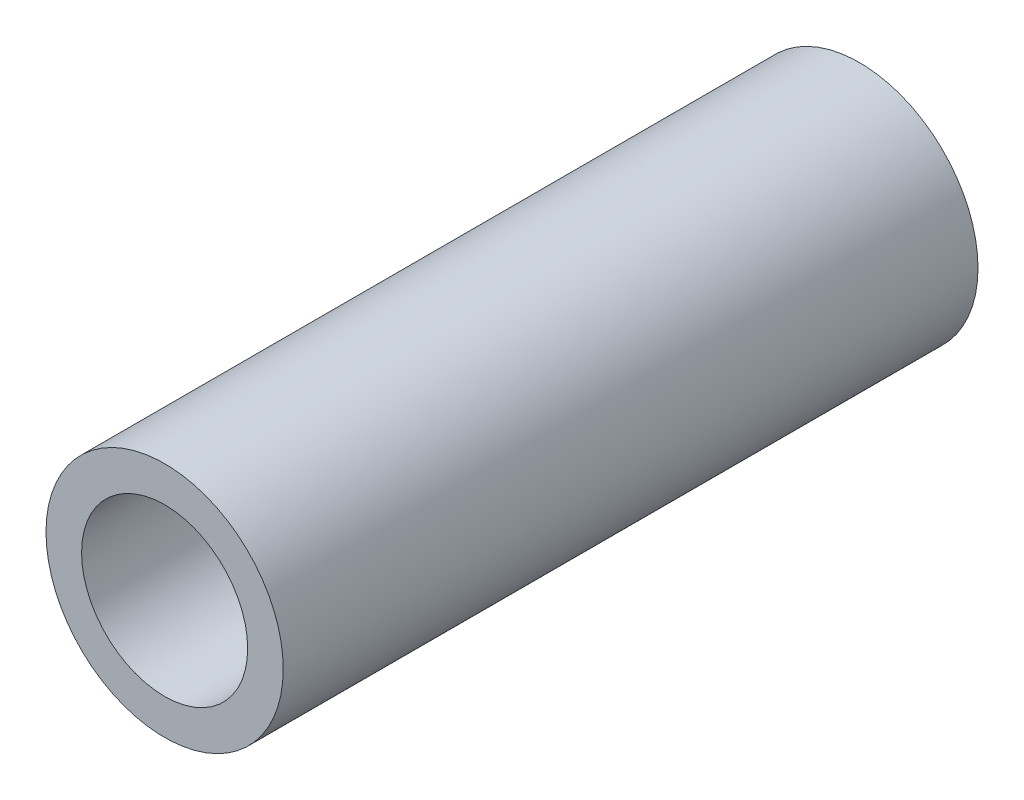
ISO-10303-21;
HEADER;
FILE_DESCRIPTION(('STEP AP214'),'2;1');
FILE_NAME('part.step','',(''),(''),'','','');
FILE_SCHEMA(('AUTOMOTIVE_DESIGN { 1 0 10303 214 1 1 1 1 }'));
ENDSEC;
DATA;
#1=APPLICATION_CONTEXT('core data for automotive mechanical design processes');
#2=APPLICATION_PROTOCOL_DEFINITION('international standard','automotive_design',2000,#1);
#3=PRODUCT_CONTEXT('',#1,'mechanical');
#4=PRODUCT('Part','Part','',(#3));
#5=PRODUCT_RELATED_PRODUCT_CATEGORY('part','',(#4));
#6=PRODUCT_DEFINITION_FORMATION('','',#4);
#7=PRODUCT_DEFINITION_CONTEXT('part definition',#1,'design');
#8=PRODUCT_DEFINITION('design','',#6,#7);
#9=PRODUCT_DEFINITION_SHAPE('','',#8);
#10=(LENGTH_UNIT() NAMED_UNIT(*) SI_UNIT(.MILLI.,.METRE.));
#11=(NAMED_UNIT(*) PLANE_ANGLE_UNIT() SI_UNIT($,.RADIAN.));
#12=(NAMED_UNIT(*) SI_UNIT($,.STERADIAN.) SOLID_ANGLE_UNIT());
#13=UNCERTAINTY_MEASURE_WITH_UNIT(LENGTH_MEASURE(1.E-05),#10,'distance_accuracy_value','');
#14=(GEOMETRIC_REPRESENTATION_CONTEXT(3) GLOBAL_UNCERTAINTY_ASSIGNED_CONTEXT((#13)) GLOBAL_UNIT_ASSIGNED_CONTEXT((#10,
#11,#12)) REPRESENTATION_CONTEXT('',''));
#15=CARTESIAN_POINT('',(0.,0.,0.));
#16=DIRECTION('',(0.,0.,1.));
#17=DIRECTION('',(1.,0.,0.));
#18=AXIS2_PLACEMENT_3D('',#15,#16,#17);
#19=CARTESIAN_POINT('',(0.,0.,10.25));
#20=DIRECTION('',(0.,0.,1.));
#21=DIRECTION('',(1.,0.,0.));
#22=AXIS2_PLACEMENT_3D('',#19,#20,#21);
#23=PLANE('',#22);
#24=CARTESIAN_POINT('',(0.,0.,10.25));
#25=DIRECTION('',(0.,0.,1.));
#26=DIRECTION('',(1.,0.,0.));
#27=AXIS2_PLACEMENT_3D('',#24,#25,#26);
#28=CIRCLE('',#27,1.75);
#29=CARTESIAN_POINT('',(1.75,0.,10.25));
#30=VERTEX_POINT('',#29);
#31=EDGE_CURVE('E10',#30,#30,#28,.T.);
#32=ORIENTED_EDGE('',*,*,#31,.T.);
#33=EDGE_LOOP('',(#32));
#34=FACE_BOUND('',#33,.T.);
#35=CARTESIAN_POINT('',(0.,0.,10.25));
#36=DIRECTION('',(0.,0.,1.));
#37=DIRECTION('',(1.,0.,0.));
#38=AXIS2_PLACEMENT_3D('',#35,#36,#37);
#39=CIRCLE('',#38,1.225);
#40=CARTESIAN_POINT('',(1.225,0.,10.25));
#41=VERTEX_POINT('',#40);
#42=EDGE_CURVE('E50',#41,#41,#39,.T.);
#43=ORIENTED_EDGE('',*,*,#42,.F.);
#44=EDGE_LOOP('',(#43));
#45=FACE_BOUND('',#44,.T.);
#46=ADVANCED_FACE('F37',(#34,#45),#23,.T.);
#47=CARTESIAN_POINT('',(0.,0.,0.));
#48=DIRECTION('',(0.,0.,1.));
#49=DIRECTION('',(1.,0.,0.));
#50=AXIS2_PLACEMENT_3D('',#47,#48,#49);
#51=PLANE('',#50);
#52=CARTESIAN_POINT('',(0.,0.,0.));
#53=DIRECTION('',(0.,0.,1.));
#54=DIRECTION('',(1.,0.,0.));
#55=AXIS2_PLACEMENT_3D('',#52,#53,#54);
#56=CIRCLE('',#55,1.75);
#57=CARTESIAN_POINT('',(1.75,0.,0.));
#58=VERTEX_POINT('',#57);
#59=EDGE_CURVE('E41',#58,#58,#56,.T.);
#60=ORIENTED_EDGE('',*,*,#59,.F.);
#61=EDGE_LOOP('',(#60));
#62=FACE_BOUND('',#61,.T.);
#63=CARTESIAN_POINT('',(0.,0.,0.));
#64=DIRECTION('',(0.,0.,1.));
#65=DIRECTION('',(1.,0.,0.));
#66=AXIS2_PLACEMENT_3D('',#63,#64,#65);
#67=CIRCLE('',#66,1.225);
#68=CARTESIAN_POINT('',(1.225,0.,0.));
#69=VERTEX_POINT('',#68);
#70=EDGE_CURVE('E52',#69,#69,#67,.T.);
#71=ORIENTED_EDGE('',*,*,#70,.T.);
#72=EDGE_LOOP('',(#71));
#73=FACE_BOUND('',#72,.T.);
#74=ADVANCED_FACE('F64',(#62,#73),#51,.F.);
#75=CARTESIAN_POINT('',(0.,0.,10.25));
#76=DIRECTION('',(0.,0.,-1.));
#77=DIRECTION('',(-1.,0.,0.));
#78=AXIS2_PLACEMENT_3D('',#75,#76,#77);
#79=CYLINDRICAL_SURFACE('',#78,1.75);
#80=ORIENTED_EDGE('',*,*,#31,.F.);
#81=EDGE_LOOP('',(#80));
#82=FACE_BOUND('',#81,.T.);
#83=ORIENTED_EDGE('',*,*,#59,.T.);
#84=EDGE_LOOP('',(#83));
#85=FACE_BOUND('',#84,.T.);
#86=ADVANCED_FACE('F39',(#82,#85),#79,.T.);
#87=CARTESIAN_POINT('',(0.,0.,10.25));
#88=DIRECTION('',(0.,0.,-1.));
#89=DIRECTION('',(-1.,0.,0.));
#90=AXIS2_PLACEMENT_3D('',#87,#88,#89);
#91=CYLINDRICAL_SURFACE('',#90,1.225);
#92=ORIENTED_EDGE('',*,*,#42,.T.);
#93=EDGE_LOOP('',(#92));
#94=FACE_BOUND('',#93,.T.);
#95=ORIENTED_EDGE('',*,*,#70,.F.);
#96=EDGE_LOOP('',(#95));
#97=FACE_BOUND('',#96,.T.);
#98=ADVANCED_FACE('F60',(#94,#97),#91,.F.);
#99=CLOSED_SHELL('',(#46,#74,#86,#98));
#100=MANIFOLD_SOLID_BREP('B2',#99);
#101=ADVANCED_BREP_SHAPE_REPRESENTATION('',(#18,#100),#14);
#102=SHAPE_DEFINITION_REPRESENTATION(#9,#101);
ENDSEC;
END-ISO-10303-21;
